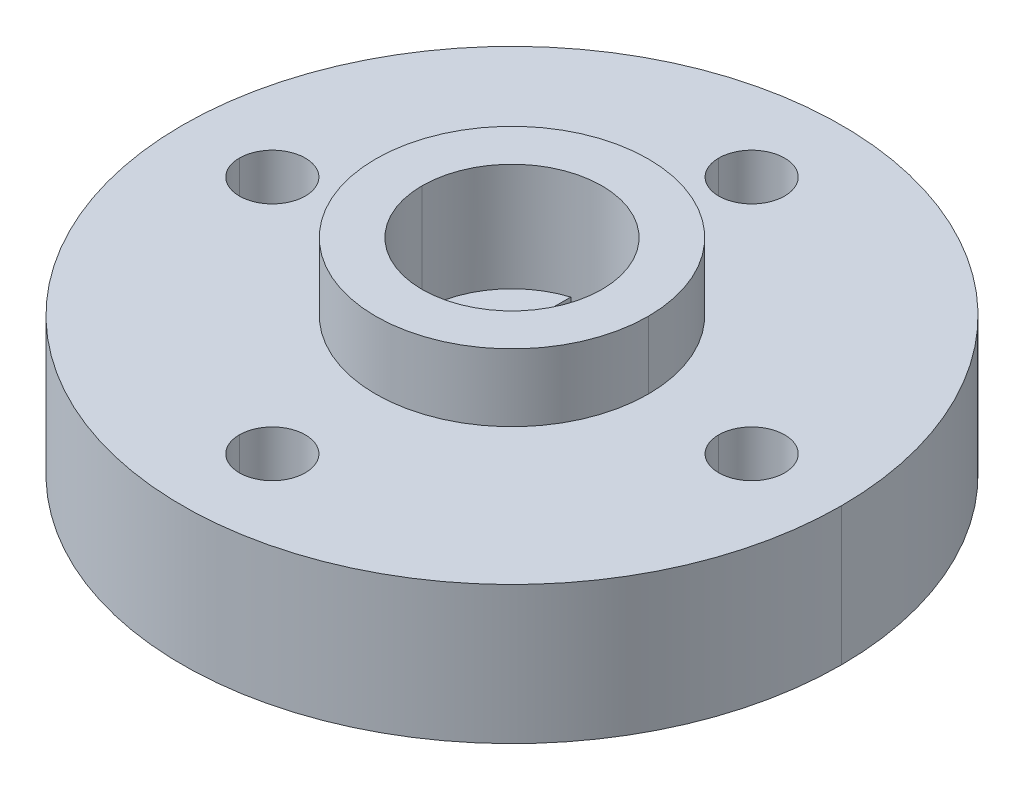
ISO-10303-21;
HEADER;
FILE_DESCRIPTION(('STEP AP214'),'2;1');
FILE_NAME('part.step','',(''),(''),'','','');
FILE_SCHEMA(('AUTOMOTIVE_DESIGN { 1 0 10303 214 1 1 1 1 }'));
ENDSEC;
DATA;
#1=APPLICATION_CONTEXT('core data for automotive mechanical design processes');
#2=APPLICATION_PROTOCOL_DEFINITION('international standard','automotive_design',2000,#1);
#3=PRODUCT_CONTEXT('',#1,'mechanical');
#4=PRODUCT('Part','Part','',(#3));
#5=PRODUCT_RELATED_PRODUCT_CATEGORY('part','',(#4));
#6=PRODUCT_DEFINITION_FORMATION('','',#4);
#7=PRODUCT_DEFINITION_CONTEXT('part definition',#1,'design');
#8=PRODUCT_DEFINITION('design','',#6,#7);
#9=PRODUCT_DEFINITION_SHAPE('','',#8);
#10=(LENGTH_UNIT() NAMED_UNIT(*) SI_UNIT(.MILLI.,.METRE.));
#11=(NAMED_UNIT(*) PLANE_ANGLE_UNIT() SI_UNIT($,.RADIAN.));
#12=(NAMED_UNIT(*) SI_UNIT($,.STERADIAN.) SOLID_ANGLE_UNIT());
#13=UNCERTAINTY_MEASURE_WITH_UNIT(LENGTH_MEASURE(1.E-05),#10,'distance_accuracy_value','');
#14=(GEOMETRIC_REPRESENTATION_CONTEXT(3) GLOBAL_UNCERTAINTY_ASSIGNED_CONTEXT((#13)) GLOBAL_UNIT_ASSIGNED_CONTEXT((#10,
#11,#12)) REPRESENTATION_CONTEXT('',''));
#15=CARTESIAN_POINT('',(0.,0.,0.));
#16=DIRECTION('',(0.,0.,1.));
#17=DIRECTION('',(1.,0.,0.));
#18=AXIS2_PLACEMENT_3D('',#15,#16,#17);
#19=CARTESIAN_POINT('',(0.,10.,8.));
#20=DIRECTION('',(0.,-1.,0.));
#21=DIRECTION('',(1.,0.,0.));
#22=AXIS2_PLACEMENT_3D('',#19,#20,#21);
#23=CYLINDRICAL_SURFACE('',#22,1.1);
#24=DIRECTION('',(0.,-1.,0.));
#25=VECTOR('',#24,1.);
#26=CARTESIAN_POINT('',(-1.1,10.,8.));
#27=LINE('',#26,#25);
#28=CARTESIAN_POINT('',(-1.1,4.6,8.));
#29=VERTEX_POINT('',#28);
#30=CARTESIAN_POINT('',(-1.1,0.,8.));
#31=VERTEX_POINT('',#30);
#32=EDGE_CURVE('E312',#29,#31,#27,.T.);
#33=ORIENTED_EDGE('',*,*,#32,.F.);
#34=CARTESIAN_POINT('',(0.,4.6,8.));
#35=DIRECTION('',(0.,-1.,0.));
#36=DIRECTION('',(1.,0.,0.));
#37=AXIS2_PLACEMENT_3D('',#34,#35,#36);
#38=CIRCLE('',#37,1.1);
#39=CARTESIAN_POINT('',(1.1,4.6,8.));
#40=VERTEX_POINT('',#39);
#41=EDGE_CURVE('E296',#40,#29,#38,.T.);
#42=ORIENTED_EDGE('',*,*,#41,.F.);
#43=DIRECTION('',(0.,-1.,0.));
#44=VECTOR('',#43,1.);
#45=CARTESIAN_POINT('',(1.1,10.,8.));
#46=LINE('',#45,#44);
#47=CARTESIAN_POINT('',(1.1,0.,8.));
#48=VERTEX_POINT('',#47);
#49=EDGE_CURVE('E311',#40,#48,#46,.T.);
#50=ORIENTED_EDGE('',*,*,#49,.T.);
#51=CARTESIAN_POINT('',(0.,0.,8.));
#52=DIRECTION('',(0.,-1.,0.));
#53=DIRECTION('',(1.,0.,0.));
#54=AXIS2_PLACEMENT_3D('',#51,#52,#53);
#55=CIRCLE('',#54,1.1);
#56=EDGE_CURVE('E317',#48,#31,#55,.T.);
#57=ORIENTED_EDGE('',*,*,#56,.T.);
#58=EDGE_LOOP('',(#33,#42,#50,#57));
#59=FACE_BOUND('',#58,.T.);
#60=ADVANCED_FACE('F19',(#59),#23,.F.);
#61=CARTESIAN_POINT('',(8.,10.,0.));
#62=DIRECTION('',(0.,-1.,0.));
#63=DIRECTION('',(1.,0.,0.));
#64=AXIS2_PLACEMENT_3D('',#61,#62,#63);
#65=CYLINDRICAL_SURFACE('',#64,1.1);
#66=DIRECTION('',(0.,-1.,0.));
#67=VECTOR('',#66,1.);
#68=CARTESIAN_POINT('',(6.9,10.,0.));
#69=LINE('',#68,#67);
#70=CARTESIAN_POINT('',(6.9,4.6,0.));
#71=VERTEX_POINT('',#70);
#72=CARTESIAN_POINT('',(6.9,0.,0.));
#73=VERTEX_POINT('',#72);
#74=EDGE_CURVE('E379',#71,#73,#69,.T.);
#75=ORIENTED_EDGE('',*,*,#74,.F.);
#76=CARTESIAN_POINT('',(8.,4.6,0.));
#77=DIRECTION('',(0.,-1.,0.));
#78=DIRECTION('',(1.,0.,0.));
#79=AXIS2_PLACEMENT_3D('',#76,#77,#78);
#80=CIRCLE('',#79,1.1);
#81=CARTESIAN_POINT('',(9.1,4.6,0.));
#82=VERTEX_POINT('',#81);
#83=EDGE_CURVE('E292',#82,#71,#80,.T.);
#84=ORIENTED_EDGE('',*,*,#83,.F.);
#85=DIRECTION('',(0.,-1.,0.));
#86=VECTOR('',#85,1.);
#87=CARTESIAN_POINT('',(9.1,10.,0.));
#88=LINE('',#87,#86);
#89=CARTESIAN_POINT('',(9.1,0.,0.));
#90=VERTEX_POINT('',#89);
#91=EDGE_CURVE('E412',#82,#90,#88,.T.);
#92=ORIENTED_EDGE('',*,*,#91,.T.);
#93=CARTESIAN_POINT('',(8.,0.,0.));
#94=DIRECTION('',(0.,-1.,0.));
#95=DIRECTION('',(1.,0.,0.));
#96=AXIS2_PLACEMENT_3D('',#93,#94,#95);
#97=CIRCLE('',#96,1.1);
#98=EDGE_CURVE('E313',#90,#73,#97,.T.);
#99=ORIENTED_EDGE('',*,*,#98,.T.);
#100=EDGE_LOOP('',(#75,#84,#92,#99));
#101=FACE_BOUND('',#100,.T.);
#102=ADVANCED_FACE('F526',(#101),#65,.F.);
#103=CARTESIAN_POINT('',(0.,10.,-8.));
#104=DIRECTION('',(0.,-1.,0.));
#105=DIRECTION('',(1.,0.,0.));
#106=AXIS2_PLACEMENT_3D('',#103,#104,#105);
#107=CYLINDRICAL_SURFACE('',#106,1.1);
#108=DIRECTION('',(0.,-1.,0.));
#109=VECTOR('',#108,1.);
#110=CARTESIAN_POINT('',(-1.1,10.,-8.));
#111=LINE('',#110,#109);
#112=CARTESIAN_POINT('',(-1.1,4.6,-8.));
#113=VERTEX_POINT('',#112);
#114=CARTESIAN_POINT('',(-1.1,0.,-8.));
#115=VERTEX_POINT('',#114);
#116=EDGE_CURVE('E285',#113,#115,#111,.T.);
#117=ORIENTED_EDGE('',*,*,#116,.F.);
#118=CARTESIAN_POINT('',(0.,4.6,-8.));
#119=DIRECTION('',(0.,-1.,0.));
#120=DIRECTION('',(1.,0.,0.));
#121=AXIS2_PLACEMENT_3D('',#118,#119,#120);
#122=CIRCLE('',#121,1.1);
#123=CARTESIAN_POINT('',(1.1,4.6,-8.));
#124=VERTEX_POINT('',#123);
#125=EDGE_CURVE('E295',#124,#113,#122,.T.);
#126=ORIENTED_EDGE('',*,*,#125,.F.);
#127=DIRECTION('',(0.,-1.,0.));
#128=VECTOR('',#127,1.);
#129=CARTESIAN_POINT('',(1.1,10.,-8.));
#130=LINE('',#129,#128);
#131=CARTESIAN_POINT('',(1.1,0.,-8.));
#132=VERTEX_POINT('',#131);
#133=EDGE_CURVE('E284',#124,#132,#130,.T.);
#134=ORIENTED_EDGE('',*,*,#133,.T.);
#135=CARTESIAN_POINT('',(0.,0.,-8.));
#136=DIRECTION('',(0.,-1.,0.));
#137=DIRECTION('',(1.,0.,0.));
#138=AXIS2_PLACEMENT_3D('',#135,#136,#137);
#139=CIRCLE('',#138,1.1);
#140=EDGE_CURVE('E316',#132,#115,#139,.T.);
#141=ORIENTED_EDGE('',*,*,#140,.T.);
#142=EDGE_LOOP('',(#117,#126,#134,#141));
#143=FACE_BOUND('',#142,.T.);
#144=ADVANCED_FACE('F556',(#143),#107,.F.);
#145=CARTESIAN_POINT('',(-8.,10.,0.));
#146=DIRECTION('',(0.,-1.,0.));
#147=DIRECTION('',(1.,0.,0.));
#148=AXIS2_PLACEMENT_3D('',#145,#146,#147);
#149=CYLINDRICAL_SURFACE('',#148,1.1);
#150=DIRECTION('',(0.,-1.,0.));
#151=VECTOR('',#150,1.);
#152=CARTESIAN_POINT('',(-9.1,10.,0.));
#153=LINE('',#152,#151);
#154=CARTESIAN_POINT('',(-9.1,4.6,0.));
#155=VERTEX_POINT('',#154);
#156=CARTESIAN_POINT('',(-9.1,0.,0.));
#157=VERTEX_POINT('',#156);
#158=EDGE_CURVE('E405',#155,#157,#153,.T.);
#159=ORIENTED_EDGE('',*,*,#158,.F.);
#160=CARTESIAN_POINT('',(-8.,4.6,0.));
#161=DIRECTION('',(0.,-1.,0.));
#162=DIRECTION('',(1.,0.,0.));
#163=AXIS2_PLACEMENT_3D('',#160,#161,#162);
#164=CIRCLE('',#163,1.1);
#165=CARTESIAN_POINT('',(-6.9,4.6,0.));
#166=VERTEX_POINT('',#165);
#167=EDGE_CURVE('E394',#166,#155,#164,.T.);
#168=ORIENTED_EDGE('',*,*,#167,.F.);
#169=DIRECTION('',(0.,-1.,0.));
#170=VECTOR('',#169,1.);
#171=CARTESIAN_POINT('',(-6.9,10.,0.));
#172=LINE('',#171,#170);
#173=CARTESIAN_POINT('',(-6.9,0.,0.));
#174=VERTEX_POINT('',#173);
#175=EDGE_CURVE('E279',#166,#174,#172,.T.);
#176=ORIENTED_EDGE('',*,*,#175,.T.);
#177=CARTESIAN_POINT('',(-8.,0.,0.));
#178=DIRECTION('',(0.,-1.,0.));
#179=DIRECTION('',(1.,0.,0.));
#180=AXIS2_PLACEMENT_3D('',#177,#178,#179);
#181=CIRCLE('',#180,1.1);
#182=EDGE_CURVE('E360',#174,#157,#181,.T.);
#183=ORIENTED_EDGE('',*,*,#182,.T.);
#184=EDGE_LOOP('',(#159,#168,#176,#183));
#185=FACE_BOUND('',#184,.T.);
#186=ADVANCED_FACE('F21',(#185),#149,.F.);
#187=CARTESIAN_POINT('',(-0.9,0.,-2.86181760425083));
#188=DIRECTION('',(-1.,0.,0.));
#189=DIRECTION('',(0.,1.,0.));
#190=AXIS2_PLACEMENT_3D('',#187,#188,#189);
#191=PLANE('',#190);
#192=DIRECTION('',(0.,1.,0.));
#193=VECTOR('',#192,1.);
#194=CARTESIAN_POINT('',(-0.9,0.,-0.867467578644874));
#195=LINE('',#194,#193);
#196=CARTESIAN_POINT('',(-0.9,1.6,-0.867467578644874));
#197=VERTEX_POINT('',#196);
#198=CARTESIAN_POINT('',(-0.9,3.25,-0.867467578644874));
#199=VERTEX_POINT('',#198);
#200=EDGE_CURVE('E11',#197,#199,#195,.T.);
#201=ORIENTED_EDGE('',*,*,#200,.F.);
#202=DIRECTION('',(0.,0.,1.));
#203=VECTOR('',#202,1.);
#204=CARTESIAN_POINT('',(-0.9,1.6,0.));
#205=LINE('',#204,#203);
#206=CARTESIAN_POINT('',(-0.9,1.6,-2.70416345659799));
#207=VERTEX_POINT('',#206);
#208=EDGE_CURVE('E300',#207,#197,#205,.T.);
#209=ORIENTED_EDGE('',*,*,#208,.F.);
#210=DIRECTION('',(0.,1.,0.));
#211=VECTOR('',#210,1.);
#212=CARTESIAN_POINT('',(-0.9,3.25,-2.70416345659799));
#213=LINE('',#212,#211);
#214=CARTESIAN_POINT('',(-0.9,0.,-2.70416345659799));
#215=VERTEX_POINT('',#214);
#216=EDGE_CURVE('E334',#215,#207,#213,.T.);
#217=ORIENTED_EDGE('',*,*,#216,.F.);
#218=DIRECTION('',(0.,0.,1.));
#219=VECTOR('',#218,1.);
#220=CARTESIAN_POINT('',(-0.9,0.,-2.86181760425083));
#221=LINE('',#220,#219);
#222=CARTESIAN_POINT('',(-0.9,0.,-2.86181760425083));
#223=VERTEX_POINT('',#222);
#224=EDGE_CURVE('E29',#223,#215,#221,.T.);
#225=ORIENTED_EDGE('',*,*,#224,.F.);
#226=DIRECTION('',(0.,1.,0.));
#227=VECTOR('',#226,1.);
#228=CARTESIAN_POINT('',(-0.9,0.,-2.86181760425083));
#229=LINE('',#228,#227);
#230=CARTESIAN_POINT('',(-0.9,3.25,-2.86181760425083));
#231=VERTEX_POINT('',#230);
#232=EDGE_CURVE('E233',#223,#231,#229,.T.);
#233=ORIENTED_EDGE('',*,*,#232,.T.);
#234=DIRECTION('',(0.,0.,-1.));
#235=VECTOR('',#234,1.);
#236=CARTESIAN_POINT('',(-0.9,3.25,0.));
#237=LINE('',#236,#235);
#238=EDGE_CURVE('E219',#199,#231,#237,.T.);
#239=ORIENTED_EDGE('',*,*,#238,.F.);
#240=EDGE_LOOP('',(#201,#209,#217,#225,#233,#239));
#241=FACE_BOUND('',#240,.T.);
#242=ADVANCED_FACE('F234',(#241),#191,.F.);
#243=CARTESIAN_POINT('',(0.9,0.,-2.86181760425084));
#244=DIRECTION('',(1.,0.,0.));
#245=DIRECTION('',(0.,1.,0.));
#246=AXIS2_PLACEMENT_3D('',#243,#244,#245);
#247=PLANE('',#246);
#248=DIRECTION('',(0.,1.,0.));
#249=VECTOR('',#248,1.);
#250=CARTESIAN_POINT('',(0.9,0.,-2.86181760425084));
#251=LINE('',#250,#249);
#252=CARTESIAN_POINT('',(0.9,0.,-2.86181760425084));
#253=VERTEX_POINT('',#252);
#254=CARTESIAN_POINT('',(0.9,3.25,-2.86181760425084));
#255=VERTEX_POINT('',#254);
#256=EDGE_CURVE('E323',#253,#255,#251,.T.);
#257=ORIENTED_EDGE('',*,*,#256,.F.);
#258=DIRECTION('',(0.,0.,-1.));
#259=VECTOR('',#258,1.);
#260=CARTESIAN_POINT('',(0.9,0.,0.));
#261=LINE('',#260,#259);
#262=CARTESIAN_POINT('',(0.9,0.,-2.70416345659799));
#263=VERTEX_POINT('',#262);
#264=EDGE_CURVE('E326',#263,#253,#261,.T.);
#265=ORIENTED_EDGE('',*,*,#264,.F.);
#266=DIRECTION('',(0.,-1.,0.));
#267=VECTOR('',#266,1.);
#268=CARTESIAN_POINT('',(0.9,3.25,-2.70416345659799));
#269=LINE('',#268,#267);
#270=CARTESIAN_POINT('',(0.9,1.6,-2.70416345659799));
#271=VERTEX_POINT('',#270);
#272=EDGE_CURVE('E348',#271,#263,#269,.T.);
#273=ORIENTED_EDGE('',*,*,#272,.F.);
#274=DIRECTION('',(0.,0.,-1.));
#275=VECTOR('',#274,1.);
#276=CARTESIAN_POINT('',(0.9,1.6,0.));
#277=LINE('',#276,#275);
#278=CARTESIAN_POINT('',(0.9,1.6,-0.867467578644873));
#279=VERTEX_POINT('',#278);
#280=EDGE_CURVE('E434',#279,#271,#277,.T.);
#281=ORIENTED_EDGE('',*,*,#280,.F.);
#282=DIRECTION('',(0.,1.,0.));
#283=VECTOR('',#282,1.);
#284=CARTESIAN_POINT('',(0.9,0.,-0.867467578644873));
#285=LINE('',#284,#283);
#286=CARTESIAN_POINT('',(0.9,3.25,-0.867467578644873));
#287=VERTEX_POINT('',#286);
#288=EDGE_CURVE('E261',#279,#287,#285,.T.);
#289=ORIENTED_EDGE('',*,*,#288,.T.);
#290=DIRECTION('',(0.,0.,1.));
#291=VECTOR('',#290,1.);
#292=CARTESIAN_POINT('',(0.9,3.25,0.));
#293=LINE('',#292,#291);
#294=EDGE_CURVE('E306',#255,#287,#293,.T.);
#295=ORIENTED_EDGE('',*,*,#294,.F.);
#296=EDGE_LOOP('',(#257,#265,#273,#281,#289,#295));
#297=FACE_BOUND('',#296,.T.);
#298=ADVANCED_FACE('F575',(#297),#247,.F.);
#299=CARTESIAN_POINT('',(0.,0.,0.));
#300=DIRECTION('',(0.,1.,0.));
#301=DIRECTION('',(-1.,0.,0.));
#302=AXIS2_PLACEMENT_3D('',#299,#300,#301);
#303=CYLINDRICAL_SURFACE('',#302,1.25);
#304=DIRECTION('',(0.,1.,0.));
#305=VECTOR('',#304,1.);
#306=CARTESIAN_POINT('',(-1.25,0.,0.));
#307=LINE('',#306,#305);
#308=CARTESIAN_POINT('',(-1.25,1.6,0.));
#309=VERTEX_POINT('',#308);
#310=CARTESIAN_POINT('',(-1.25,3.25,0.));
#311=VERTEX_POINT('',#310);
#312=EDGE_CURVE('E269',#309,#311,#307,.T.);
#313=ORIENTED_EDGE('',*,*,#312,.F.);
#314=CARTESIAN_POINT('',(0.,1.6,0.));
#315=DIRECTION('',(0.,1.,0.));
#316=DIRECTION('',(-1.,0.,0.));
#317=AXIS2_PLACEMENT_3D('',#314,#315,#316);
#318=CIRCLE('',#317,1.25);
#319=EDGE_CURVE('E230',#197,#309,#318,.T.);
#320=ORIENTED_EDGE('',*,*,#319,.F.);
#321=ORIENTED_EDGE('',*,*,#200,.T.);
#322=CARTESIAN_POINT('',(0.,3.25,0.));
#323=DIRECTION('',(0.,-1.,0.));
#324=DIRECTION('',(1.,0.,0.));
#325=AXIS2_PLACEMENT_3D('',#322,#323,#324);
#326=CIRCLE('',#325,1.25);
#327=EDGE_CURVE('E227',#311,#199,#326,.T.);
#328=ORIENTED_EDGE('',*,*,#327,.F.);
#329=EDGE_LOOP('',(#313,#320,#321,#328));
#330=FACE_BOUND('',#329,.T.);
#331=ADVANCED_FACE('F578',(#330),#303,.F.);
#332=CARTESIAN_POINT('',(2.85,0.,0.));
#333=DIRECTION('',(0.,1.,0.));
#334=DIRECTION('',(1.,0.,0.));
#335=AXIS2_PLACEMENT_3D('',#332,#333,#334);
#336=PLANE('',#335);
#337=CARTESIAN_POINT('',(0.,0.,0.));
#338=DIRECTION('',(0.,1.,0.));
#339=DIRECTION('',(-1.,0.,0.));
#340=AXIS2_PLACEMENT_3D('',#337,#338,#339);
#341=CIRCLE('',#340,2.85);
#342=CARTESIAN_POINT('',(-2.85,0.,0.));
#343=VERTEX_POINT('',#342);
#344=EDGE_CURVE('E166',#215,#343,#341,.T.);
#345=ORIENTED_EDGE('',*,*,#344,.T.);
#346=CARTESIAN_POINT('',(0.,0.,0.));
#347=DIRECTION('',(0.,1.,0.));
#348=DIRECTION('',(-1.,0.,0.));
#349=AXIS2_PLACEMENT_3D('',#346,#347,#348);
#350=CIRCLE('',#349,2.85);
#351=CARTESIAN_POINT('',(2.85,0.,0.));
#352=VERTEX_POINT('',#351);
#353=EDGE_CURVE('E256',#343,#352,#350,.T.);
#354=ORIENTED_EDGE('',*,*,#353,.T.);
#355=CARTESIAN_POINT('',(0.,0.,0.));
#356=DIRECTION('',(0.,1.,0.));
#357=DIRECTION('',(-1.,0.,0.));
#358=AXIS2_PLACEMENT_3D('',#355,#356,#357);
#359=CIRCLE('',#358,2.85);
#360=EDGE_CURVE('E401',#352,#263,#359,.T.);
#361=ORIENTED_EDGE('',*,*,#360,.T.);
#362=ORIENTED_EDGE('',*,*,#264,.T.);
#363=CARTESIAN_POINT('',(0.,0.,0.));
#364=DIRECTION('',(0.,1.,0.));
#365=DIRECTION('',(-1.,0.,0.));
#366=AXIS2_PLACEMENT_3D('',#363,#364,#365);
#367=CIRCLE('',#366,3.);
#368=EDGE_CURVE('E238',#253,#223,#367,.T.);
#369=ORIENTED_EDGE('',*,*,#368,.T.);
#370=ORIENTED_EDGE('',*,*,#224,.T.);
#371=EDGE_LOOP('',(#345,#354,#361,#362,#369,#370));
#372=FACE_BOUND('',#371,.T.);
#373=ORIENTED_EDGE('',*,*,#182,.F.);
#374=CARTESIAN_POINT('',(-8.,0.,0.));
#375=DIRECTION('',(0.,-1.,0.));
#376=DIRECTION('',(1.,0.,0.));
#377=AXIS2_PLACEMENT_3D('',#374,#375,#376);
#378=CIRCLE('',#377,1.1);
#379=EDGE_CURVE('E357',#157,#174,#378,.T.);
#380=ORIENTED_EDGE('',*,*,#379,.F.);
#381=EDGE_LOOP('',(#373,#380));
#382=FACE_BOUND('',#381,.T.);
#383=ORIENTED_EDGE('',*,*,#140,.F.);
#384=CARTESIAN_POINT('',(0.,0.,-8.));
#385=DIRECTION('',(0.,-1.,0.));
#386=DIRECTION('',(1.,0.,0.));
#387=AXIS2_PLACEMENT_3D('',#384,#385,#386);
#388=CIRCLE('',#387,1.1);
#389=EDGE_CURVE('E280',#115,#132,#388,.T.);
#390=ORIENTED_EDGE('',*,*,#389,.F.);
#391=EDGE_LOOP('',(#383,#390));
#392=FACE_BOUND('',#391,.T.);
#393=ORIENTED_EDGE('',*,*,#98,.F.);
#394=CARTESIAN_POINT('',(8.,0.,0.));
#395=DIRECTION('',(0.,-1.,0.));
#396=DIRECTION('',(1.,0.,0.));
#397=AXIS2_PLACEMENT_3D('',#394,#395,#396);
#398=CIRCLE('',#397,1.1);
#399=EDGE_CURVE('E416',#73,#90,#398,.T.);
#400=ORIENTED_EDGE('',*,*,#399,.F.);
#401=EDGE_LOOP('',(#393,#400));
#402=FACE_BOUND('',#401,.T.);
#403=ORIENTED_EDGE('',*,*,#56,.F.);
#404=CARTESIAN_POINT('',(0.,0.,8.));
#405=DIRECTION('',(0.,-1.,0.));
#406=DIRECTION('',(1.,0.,0.));
#407=AXIS2_PLACEMENT_3D('',#404,#405,#406);
#408=CIRCLE('',#407,1.1);
#409=EDGE_CURVE('E307',#31,#48,#408,.T.);
#410=ORIENTED_EDGE('',*,*,#409,.F.);
#411=EDGE_LOOP('',(#403,#410));
#412=FACE_BOUND('',#411,.T.);
#413=CARTESIAN_POINT('',(0.,0.,0.));
#414=DIRECTION('',(0.,1.,0.));
#415=DIRECTION('',(-1.,0.,0.));
#416=AXIS2_PLACEMENT_3D('',#413,#414,#415);
#417=CIRCLE('',#416,11.);
#418=CARTESIAN_POINT('',(-11.,0.,0.));
#419=VERTEX_POINT('',#418);
#420=CARTESIAN_POINT('',(11.,0.,0.));
#421=VERTEX_POINT('',#420);
#422=EDGE_CURVE('E267',#419,#421,#417,.T.);
#423=ORIENTED_EDGE('',*,*,#422,.F.);
#424=CARTESIAN_POINT('',(0.,0.,0.));
#425=DIRECTION('',(0.,1.,0.));
#426=DIRECTION('',(-1.,0.,0.));
#427=AXIS2_PLACEMENT_3D('',#424,#425,#426);
#428=CIRCLE('',#427,11.);
#429=EDGE_CURVE('E342',#421,#419,#428,.T.);
#430=ORIENTED_EDGE('',*,*,#429,.F.);
#431=EDGE_LOOP('',(#423,#430));
#432=FACE_BOUND('',#431,.T.);
#433=ADVANCED_FACE('F580',(#372,#382,#392,#402,#412,#432),#336,.F.);
#434=CARTESIAN_POINT('',(0.,3.25,0.));
#435=DIRECTION('',(0.,1.,0.));
#436=DIRECTION('',(-1.,0.,0.));
#437=AXIS2_PLACEMENT_3D('',#434,#435,#436);
#438=CYLINDRICAL_SURFACE('',#437,2.85);
#439=DIRECTION('',(0.,1.,0.));
#440=VECTOR('',#439,1.);
#441=CARTESIAN_POINT('',(-2.85,3.25,0.));
#442=LINE('',#441,#440);
#443=CARTESIAN_POINT('',(-2.85,1.6,0.));
#444=VERTEX_POINT('',#443);
#445=EDGE_CURVE('E291',#343,#444,#442,.T.);
#446=ORIENTED_EDGE('',*,*,#445,.F.);
#447=ORIENTED_EDGE('',*,*,#344,.F.);
#448=ORIENTED_EDGE('',*,*,#216,.T.);
#449=CARTESIAN_POINT('',(0.,1.6,0.));
#450=DIRECTION('',(0.,1.,0.));
#451=DIRECTION('',(-1.,0.,0.));
#452=AXIS2_PLACEMENT_3D('',#449,#450,#451);
#453=CIRCLE('',#452,2.85);
#454=EDGE_CURVE('E152',#207,#444,#453,.T.);
#455=ORIENTED_EDGE('',*,*,#454,.T.);
#456=EDGE_LOOP('',(#446,#447,#448,#455));
#457=FACE_BOUND('',#456,.T.);
#458=ADVANCED_FACE('F583',(#457),#438,.F.);
#459=CARTESIAN_POINT('',(0.,1.6,0.));
#460=DIRECTION('',(0.,1.,0.));
#461=DIRECTION('',(1.,0.,0.));
#462=AXIS2_PLACEMENT_3D('',#459,#460,#461);
#463=PLANE('',#462);
#464=ORIENTED_EDGE('',*,*,#319,.T.);
#465=CARTESIAN_POINT('',(0.,1.6,0.));
#466=DIRECTION('',(0.,1.,0.));
#467=DIRECTION('',(-1.,0.,0.));
#468=AXIS2_PLACEMENT_3D('',#465,#466,#467);
#469=CIRCLE('',#468,1.25);
#470=CARTESIAN_POINT('',(1.25,1.6,0.));
#471=VERTEX_POINT('',#470);
#472=EDGE_CURVE('E274',#309,#471,#469,.T.);
#473=ORIENTED_EDGE('',*,*,#472,.T.);
#474=CARTESIAN_POINT('',(0.,1.6,0.));
#475=DIRECTION('',(0.,1.,0.));
#476=DIRECTION('',(-1.,0.,0.));
#477=AXIS2_PLACEMENT_3D('',#474,#475,#476);
#478=CIRCLE('',#477,1.25);
#479=EDGE_CURVE('E275',#471,#279,#478,.T.);
#480=ORIENTED_EDGE('',*,*,#479,.T.);
#481=ORIENTED_EDGE('',*,*,#280,.T.);
#482=CARTESIAN_POINT('',(0.,1.6,0.));
#483=DIRECTION('',(0.,1.,0.));
#484=DIRECTION('',(-1.,0.,0.));
#485=AXIS2_PLACEMENT_3D('',#482,#483,#484);
#486=CIRCLE('',#485,2.85);
#487=CARTESIAN_POINT('',(2.85,1.6,0.));
#488=VERTEX_POINT('',#487);
#489=EDGE_CURVE('E344',#488,#271,#486,.T.);
#490=ORIENTED_EDGE('',*,*,#489,.F.);
#491=CARTESIAN_POINT('',(0.,1.6,0.));
#492=DIRECTION('',(0.,1.,0.));
#493=DIRECTION('',(-1.,0.,0.));
#494=AXIS2_PLACEMENT_3D('',#491,#492,#493);
#495=CIRCLE('',#494,2.85);
#496=EDGE_CURVE('E286',#444,#488,#495,.T.);
#497=ORIENTED_EDGE('',*,*,#496,.F.);
#498=ORIENTED_EDGE('',*,*,#454,.F.);
#499=ORIENTED_EDGE('',*,*,#208,.T.);
#500=EDGE_LOOP('',(#464,#473,#480,#481,#490,#497,#498,#499));
#501=FACE_BOUND('',#500,.T.);
#502=ADVANCED_FACE('F572',(#501),#463,.F.);
#503=CARTESIAN_POINT('',(3.,3.25,0.));
#504=DIRECTION('',(0.,-1.,0.));
#505=DIRECTION('',(0.,0.,-1.));
#506=AXIS2_PLACEMENT_3D('',#503,#504,#505);
#507=PLANE('',#506);
#508=CARTESIAN_POINT('',(0.,3.25,0.));
#509=DIRECTION('',(0.,1.,0.));
#510=DIRECTION('',(-1.,0.,0.));
#511=AXIS2_PLACEMENT_3D('',#508,#509,#510);
#512=CIRCLE('',#511,3.);
#513=CARTESIAN_POINT('',(-3.,3.25,0.));
#514=VERTEX_POINT('',#513);
#515=EDGE_CURVE('E223',#231,#514,#512,.T.);
#516=ORIENTED_EDGE('',*,*,#515,.T.);
#517=CARTESIAN_POINT('',(0.,3.25,0.));
#518=DIRECTION('',(0.,1.,0.));
#519=DIRECTION('',(-1.,0.,0.));
#520=AXIS2_PLACEMENT_3D('',#517,#518,#519);
#521=CIRCLE('',#520,3.);
#522=CARTESIAN_POINT('',(3.,3.25,0.));
#523=VERTEX_POINT('',#522);
#524=EDGE_CURVE('E330',#514,#523,#521,.T.);
#525=ORIENTED_EDGE('',*,*,#524,.T.);
#526=CARTESIAN_POINT('',(0.,3.25,0.));
#527=DIRECTION('',(0.,1.,0.));
#528=DIRECTION('',(-1.,0.,0.));
#529=AXIS2_PLACEMENT_3D('',#526,#527,#528);
#530=CIRCLE('',#529,3.);
#531=EDGE_CURVE('E290',#523,#255,#530,.T.);
#532=ORIENTED_EDGE('',*,*,#531,.T.);
#533=ORIENTED_EDGE('',*,*,#294,.T.);
#534=CARTESIAN_POINT('',(0.,3.25,0.));
#535=DIRECTION('',(0.,-1.,0.));
#536=DIRECTION('',(1.,0.,0.));
#537=AXIS2_PLACEMENT_3D('',#534,#535,#536);
#538=CIRCLE('',#537,1.25);
#539=CARTESIAN_POINT('',(1.25,3.25,0.));
#540=VERTEX_POINT('',#539);
#541=EDGE_CURVE('E258',#287,#540,#538,.T.);
#542=ORIENTED_EDGE('',*,*,#541,.T.);
#543=CARTESIAN_POINT('',(0.,3.25,0.));
#544=DIRECTION('',(0.,-1.,0.));
#545=DIRECTION('',(1.,0.,0.));
#546=AXIS2_PLACEMENT_3D('',#543,#544,#545);
#547=CIRCLE('',#546,1.25);
#548=EDGE_CURVE('E273',#540,#311,#547,.T.);
#549=ORIENTED_EDGE('',*,*,#548,.T.);
#550=ORIENTED_EDGE('',*,*,#327,.T.);
#551=ORIENTED_EDGE('',*,*,#238,.T.);
#552=EDGE_LOOP('',(#516,#525,#532,#533,#542,#549,#550,#551));
#553=FACE_BOUND('',#552,.T.);
#554=ADVANCED_FACE('F221',(#553),#507,.F.);
#555=CARTESIAN_POINT('',(0.,3.25,0.));
#556=DIRECTION('',(0.,1.,0.));
#557=DIRECTION('',(-1.,0.,0.));
#558=AXIS2_PLACEMENT_3D('',#555,#556,#557);
#559=CYLINDRICAL_SURFACE('',#558,3.);
#560=DIRECTION('',(0.,1.,0.));
#561=VECTOR('',#560,1.);
#562=CARTESIAN_POINT('',(3.,3.25,0.));
#563=LINE('',#562,#561);
#564=CARTESIAN_POINT('',(3.,6.85,0.));
#565=VERTEX_POINT('',#564);
#566=EDGE_CURVE('E299',#523,#565,#563,.T.);
#567=ORIENTED_EDGE('',*,*,#566,.F.);
#568=ORIENTED_EDGE('',*,*,#524,.F.);
#569=DIRECTION('',(0.,1.,0.));
#570=VECTOR('',#569,1.);
#571=CARTESIAN_POINT('',(-3.,3.25,0.));
#572=LINE('',#571,#570);
#573=CARTESIAN_POINT('',(-3.,6.85,0.));
#574=VERTEX_POINT('',#573);
#575=EDGE_CURVE('E244',#514,#574,#572,.T.);
#576=ORIENTED_EDGE('',*,*,#575,.T.);
#577=CARTESIAN_POINT('',(0.,6.85,0.));
#578=DIRECTION('',(0.,1.,0.));
#579=DIRECTION('',(-1.,0.,0.));
#580=AXIS2_PLACEMENT_3D('',#577,#578,#579);
#581=CIRCLE('',#580,3.);
#582=EDGE_CURVE('E327',#574,#565,#581,.T.);
#583=ORIENTED_EDGE('',*,*,#582,.T.);
#584=EDGE_LOOP('',(#567,#568,#576,#583));
#585=FACE_BOUND('',#584,.T.);
#586=ADVANCED_FACE('F636',(#585),#559,.F.);
#587=CARTESIAN_POINT('',(4.55,6.85,0.));
#588=DIRECTION('',(0.,-1.,0.));
#589=DIRECTION('',(0.,0.,-1.));
#590=AXIS2_PLACEMENT_3D('',#587,#588,#589);
#591=PLANE('',#590);
#592=ORIENTED_EDGE('',*,*,#582,.F.);
#593=CARTESIAN_POINT('',(0.,6.85,0.));
#594=DIRECTION('',(0.,1.,0.));
#595=DIRECTION('',(-1.,0.,0.));
#596=AXIS2_PLACEMENT_3D('',#593,#594,#595);
#597=CIRCLE('',#596,3.);
#598=EDGE_CURVE('E252',#565,#574,#597,.T.);
#599=ORIENTED_EDGE('',*,*,#598,.F.);
#600=EDGE_LOOP('',(#592,#599));
#601=FACE_BOUND('',#600,.T.);
#602=CARTESIAN_POINT('',(0.,6.85,0.));
#603=DIRECTION('',(0.,1.,0.));
#604=DIRECTION('',(-1.,0.,0.));
#605=AXIS2_PLACEMENT_3D('',#602,#603,#604);
#606=CIRCLE('',#605,4.55);
#607=CARTESIAN_POINT('',(-4.55,6.85,0.));
#608=VERTEX_POINT('',#607);
#609=CARTESIAN_POINT('',(4.55,6.85,0.));
#610=VERTEX_POINT('',#609);
#611=EDGE_CURVE('E268',#608,#610,#606,.T.);
#612=ORIENTED_EDGE('',*,*,#611,.T.);
#613=CARTESIAN_POINT('',(0.,6.85,0.));
#614=DIRECTION('',(0.,1.,0.));
#615=DIRECTION('',(-1.,0.,0.));
#616=AXIS2_PLACEMENT_3D('',#613,#614,#615);
#617=CIRCLE('',#616,4.55);
#618=EDGE_CURVE('E331',#610,#608,#617,.T.);
#619=ORIENTED_EDGE('',*,*,#618,.T.);
#620=EDGE_LOOP('',(#612,#619));
#621=FACE_BOUND('',#620,.T.);
#622=ADVANCED_FACE('F545',(#601,#621),#591,.F.);
#623=CARTESIAN_POINT('',(0.,3.25,0.));
#624=DIRECTION('',(0.,1.,0.));
#625=DIRECTION('',(-1.,0.,0.));
#626=AXIS2_PLACEMENT_3D('',#623,#624,#625);
#627=CYLINDRICAL_SURFACE('',#626,4.55);
#628=DIRECTION('',(0.,1.,0.));
#629=VECTOR('',#628,1.);
#630=CARTESIAN_POINT('',(4.55,3.25,0.));
#631=LINE('',#630,#629);
#632=CARTESIAN_POINT('',(4.55,4.6,0.));
#633=VERTEX_POINT('',#632);
#634=EDGE_CURVE('E322',#633,#610,#631,.T.);
#635=ORIENTED_EDGE('',*,*,#634,.F.);
#636=CARTESIAN_POINT('',(0.,4.6,0.));
#637=DIRECTION('',(0.,1.,0.));
#638=DIRECTION('',(-1.,0.,0.));
#639=AXIS2_PLACEMENT_3D('',#636,#637,#638);
#640=CIRCLE('',#639,4.55);
#641=CARTESIAN_POINT('',(-4.55,4.6,0.));
#642=VERTEX_POINT('',#641);
#643=EDGE_CURVE('E397',#633,#642,#640,.T.);
#644=ORIENTED_EDGE('',*,*,#643,.T.);
#645=DIRECTION('',(0.,1.,0.));
#646=VECTOR('',#645,1.);
#647=CARTESIAN_POINT('',(-4.55,3.25,0.));
#648=LINE('',#647,#646);
#649=EDGE_CURVE('E263',#642,#608,#648,.T.);
#650=ORIENTED_EDGE('',*,*,#649,.T.);
#651=ORIENTED_EDGE('',*,*,#618,.F.);
#652=EDGE_LOOP('',(#635,#644,#650,#651));
#653=FACE_BOUND('',#652,.T.);
#654=ADVANCED_FACE('F534',(#653),#627,.T.);
#655=CARTESIAN_POINT('',(11.,4.6,0.));
#656=DIRECTION('',(0.,-1.,0.));
#657=DIRECTION('',(0.,0.,-1.));
#658=AXIS2_PLACEMENT_3D('',#655,#656,#657);
#659=PLANE('',#658);
#660=CARTESIAN_POINT('',(0.,4.6,0.));
#661=DIRECTION('',(0.,1.,0.));
#662=DIRECTION('',(-1.,0.,0.));
#663=AXIS2_PLACEMENT_3D('',#660,#661,#662);
#664=CIRCLE('',#663,4.55);
#665=EDGE_CURVE('E318',#642,#633,#664,.T.);
#666=ORIENTED_EDGE('',*,*,#665,.F.);
#667=ORIENTED_EDGE('',*,*,#643,.F.);
#668=EDGE_LOOP('',(#666,#667));
#669=FACE_BOUND('',#668,.T.);
#670=ORIENTED_EDGE('',*,*,#167,.T.);
#671=CARTESIAN_POINT('',(-8.,4.6,0.));
#672=DIRECTION('',(0.,-1.,0.));
#673=DIRECTION('',(1.,0.,0.));
#674=AXIS2_PLACEMENT_3D('',#671,#672,#673);
#675=CIRCLE('',#674,1.1);
#676=EDGE_CURVE('E353',#155,#166,#675,.T.);
#677=ORIENTED_EDGE('',*,*,#676,.T.);
#678=EDGE_LOOP('',(#670,#677));
#679=FACE_BOUND('',#678,.T.);
#680=ORIENTED_EDGE('',*,*,#125,.T.);
#681=CARTESIAN_POINT('',(0.,4.6,-8.));
#682=DIRECTION('',(0.,-1.,0.));
#683=DIRECTION('',(1.,0.,0.));
#684=AXIS2_PLACEMENT_3D('',#681,#682,#683);
#685=CIRCLE('',#684,1.1);
#686=EDGE_CURVE('E387',#113,#124,#685,.T.);
#687=ORIENTED_EDGE('',*,*,#686,.T.);
#688=EDGE_LOOP('',(#680,#687));
#689=FACE_BOUND('',#688,.T.);
#690=ORIENTED_EDGE('',*,*,#83,.T.);
#691=CARTESIAN_POINT('',(8.,4.6,0.));
#692=DIRECTION('',(0.,-1.,0.));
#693=DIRECTION('',(1.,0.,0.));
#694=AXIS2_PLACEMENT_3D('',#691,#692,#693);
#695=CIRCLE('',#694,1.1);
#696=EDGE_CURVE('E373',#71,#82,#695,.T.);
#697=ORIENTED_EDGE('',*,*,#696,.T.);
#698=EDGE_LOOP('',(#690,#697));
#699=FACE_BOUND('',#698,.T.);
#700=ORIENTED_EDGE('',*,*,#41,.T.);
#701=CARTESIAN_POINT('',(0.,4.6,8.));
#702=DIRECTION('',(0.,-1.,0.));
#703=DIRECTION('',(1.,0.,0.));
#704=AXIS2_PLACEMENT_3D('',#701,#702,#703);
#705=CIRCLE('',#704,1.1);
#706=EDGE_CURVE('E390',#29,#40,#705,.T.);
#707=ORIENTED_EDGE('',*,*,#706,.T.);
#708=EDGE_LOOP('',(#700,#707));
#709=FACE_BOUND('',#708,.T.);
#710=CARTESIAN_POINT('',(0.,4.6,0.));
#711=DIRECTION('',(0.,1.,0.));
#712=DIRECTION('',(-1.,0.,0.));
#713=AXIS2_PLACEMENT_3D('',#710,#711,#712);
#714=CIRCLE('',#713,11.);
#715=CARTESIAN_POINT('',(-11.,4.6,0.));
#716=VERTEX_POINT('',#715);
#717=CARTESIAN_POINT('',(11.,4.6,0.));
#718=VERTEX_POINT('',#717);
#719=EDGE_CURVE('E343',#716,#718,#714,.T.);
#720=ORIENTED_EDGE('',*,*,#719,.T.);
#721=CARTESIAN_POINT('',(0.,4.6,0.));
#722=DIRECTION('',(0.,1.,0.));
#723=DIRECTION('',(-1.,0.,0.));
#724=AXIS2_PLACEMENT_3D('',#721,#722,#723);
#725=CIRCLE('',#724,11.);
#726=EDGE_CURVE('E380',#718,#716,#725,.T.);
#727=ORIENTED_EDGE('',*,*,#726,.T.);
#728=EDGE_LOOP('',(#720,#727));
#729=FACE_BOUND('',#728,.T.);
#730=ADVANCED_FACE('F501',(#669,#679,#689,#699,#709,#729),#659,.F.);
#731=CARTESIAN_POINT('',(0.,3.25,0.));
#732=DIRECTION('',(0.,1.,0.));
#733=DIRECTION('',(-1.,0.,0.));
#734=AXIS2_PLACEMENT_3D('',#731,#732,#733);
#735=CYLINDRICAL_SURFACE('',#734,11.);
#736=DIRECTION('',(0.,1.,0.));
#737=VECTOR('',#736,1.);
#738=CARTESIAN_POINT('',(11.,3.25,0.));
#739=LINE('',#738,#737);
#740=EDGE_CURVE('E369',#421,#718,#739,.T.);
#741=ORIENTED_EDGE('',*,*,#740,.F.);
#742=ORIENTED_EDGE('',*,*,#429,.T.);
#743=DIRECTION('',(0.,1.,0.));
#744=VECTOR('',#743,1.);
#745=CARTESIAN_POINT('',(-11.,3.25,0.));
#746=LINE('',#745,#744);
#747=EDGE_CURVE('E338',#419,#716,#746,.T.);
#748=ORIENTED_EDGE('',*,*,#747,.T.);
#749=ORIENTED_EDGE('',*,*,#726,.F.);
#750=EDGE_LOOP('',(#741,#742,#748,#749));
#751=FACE_BOUND('',#750,.T.);
#752=ADVANCED_FACE('F533',(#751),#735,.T.);
#753=CARTESIAN_POINT('',(0.,3.25,0.));
#754=DIRECTION('',(0.,1.,0.));
#755=DIRECTION('',(-1.,0.,0.));
#756=AXIS2_PLACEMENT_3D('',#753,#754,#755);
#757=CYLINDRICAL_SURFACE('',#756,11.);
#758=ORIENTED_EDGE('',*,*,#422,.T.);
#759=ORIENTED_EDGE('',*,*,#740,.T.);
#760=ORIENTED_EDGE('',*,*,#719,.F.);
#761=ORIENTED_EDGE('',*,*,#747,.F.);
#762=EDGE_LOOP('',(#758,#759,#760,#761));
#763=FACE_BOUND('',#762,.T.);
#764=ADVANCED_FACE('F542',(#763),#757,.T.);
#765=CARTESIAN_POINT('',(0.,3.25,0.));
#766=DIRECTION('',(0.,1.,0.));
#767=DIRECTION('',(-1.,0.,0.));
#768=AXIS2_PLACEMENT_3D('',#765,#766,#767);
#769=CYLINDRICAL_SURFACE('',#768,4.55);
#770=ORIENTED_EDGE('',*,*,#665,.T.);
#771=ORIENTED_EDGE('',*,*,#634,.T.);
#772=ORIENTED_EDGE('',*,*,#611,.F.);
#773=ORIENTED_EDGE('',*,*,#649,.F.);
#774=EDGE_LOOP('',(#770,#771,#772,#773));
#775=FACE_BOUND('',#774,.T.);
#776=ADVANCED_FACE('F584',(#775),#769,.T.);
#777=CARTESIAN_POINT('',(0.,3.25,0.));
#778=DIRECTION('',(0.,1.,0.));
#779=DIRECTION('',(-1.,0.,0.));
#780=AXIS2_PLACEMENT_3D('',#777,#778,#779);
#781=CYLINDRICAL_SURFACE('',#780,3.);
#782=ORIENTED_EDGE('',*,*,#531,.F.);
#783=ORIENTED_EDGE('',*,*,#566,.T.);
#784=ORIENTED_EDGE('',*,*,#598,.T.);
#785=ORIENTED_EDGE('',*,*,#575,.F.);
#786=ORIENTED_EDGE('',*,*,#515,.F.);
#787=ORIENTED_EDGE('',*,*,#232,.F.);
#788=ORIENTED_EDGE('',*,*,#368,.F.);
#789=ORIENTED_EDGE('',*,*,#256,.T.);
#790=EDGE_LOOP('',(#782,#783,#784,#785,#786,#787,#788,#789));
#791=FACE_BOUND('',#790,.T.);
#792=ADVANCED_FACE('F241',(#791),#781,.F.);
#793=CARTESIAN_POINT('',(0.,3.25,0.));
#794=DIRECTION('',(0.,1.,0.));
#795=DIRECTION('',(-1.,0.,0.));
#796=AXIS2_PLACEMENT_3D('',#793,#794,#795);
#797=CYLINDRICAL_SURFACE('',#796,2.85);
#798=DIRECTION('',(0.,1.,0.));
#799=VECTOR('',#798,1.);
#800=CARTESIAN_POINT('',(2.85,3.25,0.));
#801=LINE('',#800,#799);
#802=EDGE_CURVE('E349',#352,#488,#801,.T.);
#803=ORIENTED_EDGE('',*,*,#802,.F.);
#804=ORIENTED_EDGE('',*,*,#353,.F.);
#805=ORIENTED_EDGE('',*,*,#445,.T.);
#806=ORIENTED_EDGE('',*,*,#496,.T.);
#807=EDGE_LOOP('',(#803,#804,#805,#806));
#808=FACE_BOUND('',#807,.T.);
#809=ADVANCED_FACE('F588',(#808),#797,.F.);
#810=CARTESIAN_POINT('',(0.,3.25,0.));
#811=DIRECTION('',(0.,1.,0.));
#812=DIRECTION('',(-1.,0.,0.));
#813=AXIS2_PLACEMENT_3D('',#810,#811,#812);
#814=CYLINDRICAL_SURFACE('',#813,2.85);
#815=ORIENTED_EDGE('',*,*,#360,.F.);
#816=ORIENTED_EDGE('',*,*,#802,.T.);
#817=ORIENTED_EDGE('',*,*,#489,.T.);
#818=ORIENTED_EDGE('',*,*,#272,.T.);
#819=EDGE_LOOP('',(#815,#816,#817,#818));
#820=FACE_BOUND('',#819,.T.);
#821=ADVANCED_FACE('F591',(#820),#814,.F.);
#822=CARTESIAN_POINT('',(0.,0.,0.));
#823=DIRECTION('',(0.,1.,0.));
#824=DIRECTION('',(-1.,0.,0.));
#825=AXIS2_PLACEMENT_3D('',#822,#823,#824);
#826=CYLINDRICAL_SURFACE('',#825,1.25);
#827=DIRECTION('',(0.,1.,0.));
#828=VECTOR('',#827,1.);
#829=CARTESIAN_POINT('',(1.25,0.,0.));
#830=LINE('',#829,#828);
#831=EDGE_CURVE('E262',#471,#540,#830,.T.);
#832=ORIENTED_EDGE('',*,*,#831,.F.);
#833=ORIENTED_EDGE('',*,*,#472,.F.);
#834=ORIENTED_EDGE('',*,*,#312,.T.);
#835=ORIENTED_EDGE('',*,*,#548,.F.);
#836=EDGE_LOOP('',(#832,#833,#834,#835));
#837=FACE_BOUND('',#836,.T.);
#838=ADVANCED_FACE('F598',(#837),#826,.F.);
#839=CARTESIAN_POINT('',(0.,0.,0.));
#840=DIRECTION('',(0.,1.,0.));
#841=DIRECTION('',(-1.,0.,0.));
#842=AXIS2_PLACEMENT_3D('',#839,#840,#841);
#843=CYLINDRICAL_SURFACE('',#842,1.25);
#844=ORIENTED_EDGE('',*,*,#479,.F.);
#845=ORIENTED_EDGE('',*,*,#831,.T.);
#846=ORIENTED_EDGE('',*,*,#541,.F.);
#847=ORIENTED_EDGE('',*,*,#288,.F.);
#848=EDGE_LOOP('',(#844,#845,#846,#847));
#849=FACE_BOUND('',#848,.T.);
#850=ADVANCED_FACE('F595',(#849),#843,.F.);
#851=CARTESIAN_POINT('',(-8.,10.,0.));
#852=DIRECTION('',(0.,-1.,0.));
#853=DIRECTION('',(1.,0.,0.));
#854=AXIS2_PLACEMENT_3D('',#851,#852,#853);
#855=CYLINDRICAL_SURFACE('',#854,1.1);
#856=ORIENTED_EDGE('',*,*,#676,.F.);
#857=ORIENTED_EDGE('',*,*,#158,.T.);
#858=ORIENTED_EDGE('',*,*,#379,.T.);
#859=ORIENTED_EDGE('',*,*,#175,.F.);
#860=EDGE_LOOP('',(#856,#857,#858,#859));
#861=FACE_BOUND('',#860,.T.);
#862=ADVANCED_FACE('F567',(#861),#855,.F.);
#863=CARTESIAN_POINT('',(0.,10.,-8.));
#864=DIRECTION('',(0.,-1.,0.));
#865=DIRECTION('',(1.,0.,0.));
#866=AXIS2_PLACEMENT_3D('',#863,#864,#865);
#867=CYLINDRICAL_SURFACE('',#866,1.1);
#868=ORIENTED_EDGE('',*,*,#686,.F.);
#869=ORIENTED_EDGE('',*,*,#116,.T.);
#870=ORIENTED_EDGE('',*,*,#389,.T.);
#871=ORIENTED_EDGE('',*,*,#133,.F.);
#872=EDGE_LOOP('',(#868,#869,#870,#871));
#873=FACE_BOUND('',#872,.T.);
#874=ADVANCED_FACE('F562',(#873),#867,.F.);
#875=CARTESIAN_POINT('',(8.,10.,0.));
#876=DIRECTION('',(0.,-1.,0.));
#877=DIRECTION('',(1.,0.,0.));
#878=AXIS2_PLACEMENT_3D('',#875,#876,#877);
#879=CYLINDRICAL_SURFACE('',#878,1.1);
#880=ORIENTED_EDGE('',*,*,#696,.F.);
#881=ORIENTED_EDGE('',*,*,#74,.T.);
#882=ORIENTED_EDGE('',*,*,#399,.T.);
#883=ORIENTED_EDGE('',*,*,#91,.F.);
#884=EDGE_LOOP('',(#880,#881,#882,#883));
#885=FACE_BOUND('',#884,.T.);
#886=ADVANCED_FACE('F530',(#885),#879,.F.);
#887=CARTESIAN_POINT('',(0.,10.,8.));
#888=DIRECTION('',(0.,-1.,0.));
#889=DIRECTION('',(1.,0.,0.));
#890=AXIS2_PLACEMENT_3D('',#887,#888,#889);
#891=CYLINDRICAL_SURFACE('',#890,1.1);
#892=ORIENTED_EDGE('',*,*,#706,.F.);
#893=ORIENTED_EDGE('',*,*,#32,.T.);
#894=ORIENTED_EDGE('',*,*,#409,.T.);
#895=ORIENTED_EDGE('',*,*,#49,.F.);
#896=EDGE_LOOP('',(#892,#893,#894,#895));
#897=FACE_BOUND('',#896,.T.);
#898=ADVANCED_FACE('F506',(#897),#891,.F.);
#899=CLOSED_SHELL('',(#60,#102,#144,#186,#242,#298,#331,#433,#458,#502,#554,#586,#622,#654,#730,
#752,#764,#776,#792,#809,#821,#838,#850,#862,#874,#886,#898));
#900=MANIFOLD_SOLID_BREP('B1',#899);
#901=ADVANCED_BREP_SHAPE_REPRESENTATION('',(#18,#900),#14);
#902=SHAPE_DEFINITION_REPRESENTATION(#9,#901);
ENDSEC;
END-ISO-10303-21;
